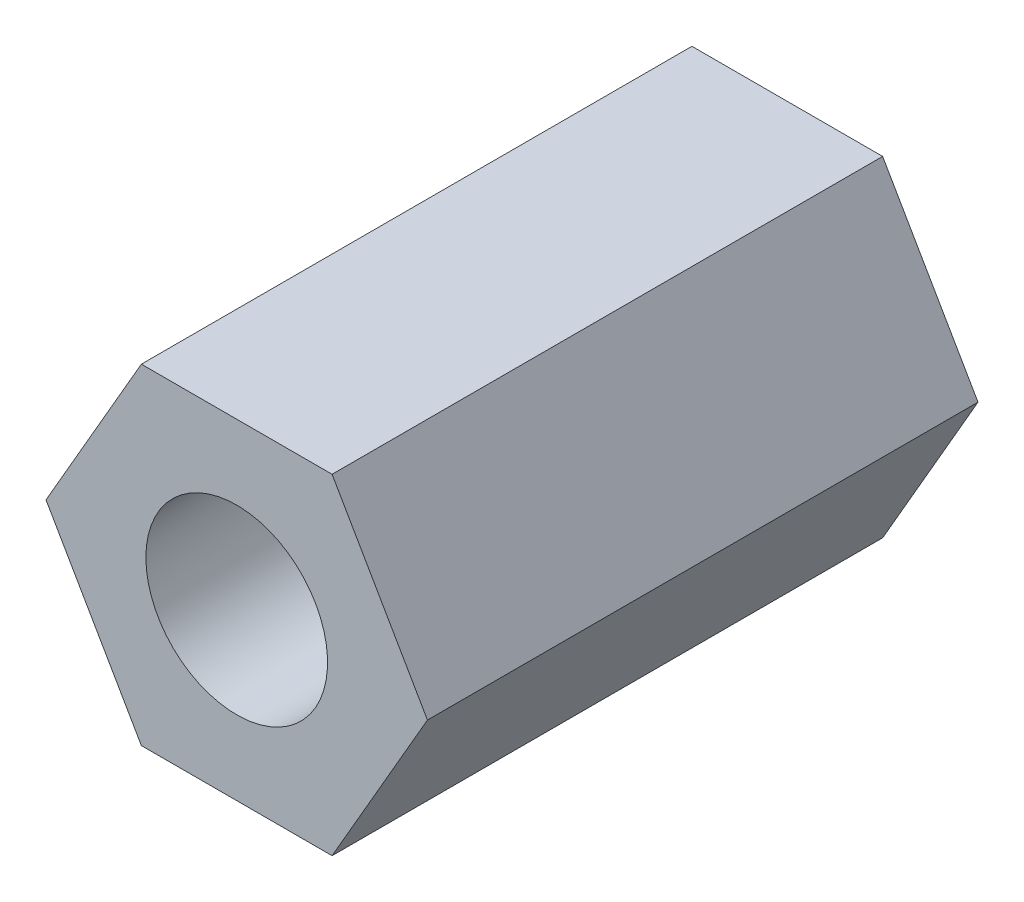
ISO-10303-21;
HEADER;
FILE_DESCRIPTION(('STEP AP214'),'2;1');
FILE_NAME('part.step','',(''),(''),'','','');
FILE_SCHEMA(('AUTOMOTIVE_DESIGN { 1 0 10303 214 1 1 1 1 }'));
ENDSEC;
DATA;
#1=APPLICATION_CONTEXT('core data for automotive mechanical design processes');
#2=APPLICATION_PROTOCOL_DEFINITION('international standard','automotive_design',2000,#1);
#3=PRODUCT_CONTEXT('',#1,'mechanical');
#4=PRODUCT('Part','Part','',(#3));
#5=PRODUCT_RELATED_PRODUCT_CATEGORY('part','',(#4));
#6=PRODUCT_DEFINITION_FORMATION('','',#4);
#7=PRODUCT_DEFINITION_CONTEXT('part definition',#1,'design');
#8=PRODUCT_DEFINITION('design','',#6,#7);
#9=PRODUCT_DEFINITION_SHAPE('','',#8);
#10=(LENGTH_UNIT() NAMED_UNIT(*) SI_UNIT(.MILLI.,.METRE.));
#11=(NAMED_UNIT(*) PLANE_ANGLE_UNIT() SI_UNIT($,.RADIAN.));
#12=(NAMED_UNIT(*) SI_UNIT($,.STERADIAN.) SOLID_ANGLE_UNIT());
#13=UNCERTAINTY_MEASURE_WITH_UNIT(LENGTH_MEASURE(1.E-05),#10,'distance_accuracy_value','');
#14=(GEOMETRIC_REPRESENTATION_CONTEXT(3) GLOBAL_UNCERTAINTY_ASSIGNED_CONTEXT((#13)) GLOBAL_UNIT_ASSIGNED_CONTEXT((#10,
#11,#12)) REPRESENTATION_CONTEXT('',''));
#15=CARTESIAN_POINT('',(0.,0.,0.));
#16=DIRECTION('',(0.,0.,1.));
#17=DIRECTION('',(1.,0.,0.));
#18=AXIS2_PLACEMENT_3D('',#15,#16,#17);
#19=CARTESIAN_POINT('',(1.7320508075689,-2.99999999999996,10.));
#20=DIRECTION('',(-0.866025403784442,0.499999999999995,0.));
#21=DIRECTION('',(-0.499999999999995,-0.866025403784442,0.));
#22=AXIS2_PLACEMENT_3D('',#19,#20,#21);
#23=PLANE('',#22);
#24=DIRECTION('',(0.499999999999995,0.866025403784442,0.));
#25=VECTOR('',#24,1.);
#26=CARTESIAN_POINT('',(1.7320508075689,-2.99999999999996,0.));
#27=LINE('',#26,#25);
#28=CARTESIAN_POINT('',(1.7320508075689,-2.99999999999996,0.));
#29=VERTEX_POINT('',#28);
#30=CARTESIAN_POINT('',(3.46410161513774,0.,0.));
#31=VERTEX_POINT('',#30);
#32=EDGE_CURVE('E140',#29,#31,#27,.T.);
#33=ORIENTED_EDGE('',*,*,#32,.T.);
#34=DIRECTION('',(0.,0.,-1.));
#35=VECTOR('',#34,1.);
#36=CARTESIAN_POINT('',(3.46410161513774,0.,10.));
#37=LINE('',#36,#35);
#38=CARTESIAN_POINT('',(3.46410161513774,0.,10.));
#39=VERTEX_POINT('',#38);
#40=EDGE_CURVE('E11',#39,#31,#37,.T.);
#41=ORIENTED_EDGE('',*,*,#40,.F.);
#42=DIRECTION('',(0.499999999999995,0.866025403784442,0.));
#43=VECTOR('',#42,1.);
#44=CARTESIAN_POINT('',(1.7320508075689,-2.99999999999996,10.));
#45=LINE('',#44,#43);
#46=CARTESIAN_POINT('',(1.7320508075689,-2.99999999999996,10.));
#47=VERTEX_POINT('',#46);
#48=EDGE_CURVE('E157',#47,#39,#45,.T.);
#49=ORIENTED_EDGE('',*,*,#48,.F.);
#50=DIRECTION('',(0.,0.,-1.));
#51=VECTOR('',#50,1.);
#52=CARTESIAN_POINT('',(1.7320508075689,-2.99999999999996,10.));
#53=LINE('',#52,#51);
#54=EDGE_CURVE('E136',#47,#29,#53,.T.);
#55=ORIENTED_EDGE('',*,*,#54,.T.);
#56=EDGE_LOOP('',(#33,#41,#49,#55));
#57=FACE_BOUND('',#56,.T.);
#58=ADVANCED_FACE('F51',(#57),#23,.F.);
#59=CARTESIAN_POINT('',(3.46410161513774,0.,10.));
#60=DIRECTION('',(-0.866025403784438,-0.500000000000001,0.));
#61=DIRECTION('',(0.500000000000001,-0.866025403784438,0.));
#62=AXIS2_PLACEMENT_3D('',#59,#60,#61);
#63=PLANE('',#62);
#64=DIRECTION('',(-0.500000000000001,0.866025403784438,0.));
#65=VECTOR('',#64,1.);
#66=CARTESIAN_POINT('',(3.46410161513774,0.,0.));
#67=LINE('',#66,#65);
#68=CARTESIAN_POINT('',(1.73205080756886,2.99999999999999,0.));
#69=VERTEX_POINT('',#68);
#70=EDGE_CURVE('E144',#31,#69,#67,.T.);
#71=ORIENTED_EDGE('',*,*,#70,.T.);
#72=DIRECTION('',(0.,0.,-1.));
#73=VECTOR('',#72,1.);
#74=CARTESIAN_POINT('',(1.73205080756886,2.99999999999999,10.));
#75=LINE('',#74,#73);
#76=CARTESIAN_POINT('',(1.73205080756886,2.99999999999999,10.));
#77=VERTEX_POINT('',#76);
#78=EDGE_CURVE('E60',#77,#69,#75,.T.);
#79=ORIENTED_EDGE('',*,*,#78,.F.);
#80=DIRECTION('',(-0.500000000000001,0.866025403784438,0.));
#81=VECTOR('',#80,1.);
#82=CARTESIAN_POINT('',(3.46410161513774,0.,10.));
#83=LINE('',#82,#81);
#84=EDGE_CURVE('E105',#39,#77,#83,.T.);
#85=ORIENTED_EDGE('',*,*,#84,.F.);
#86=ORIENTED_EDGE('',*,*,#40,.T.);
#87=EDGE_LOOP('',(#71,#79,#85,#86));
#88=FACE_BOUND('',#87,.T.);
#89=ADVANCED_FACE('F186',(#88),#63,.F.);
#90=CARTESIAN_POINT('',(1.73205080756886,2.99999999999999,10.));
#91=DIRECTION('',(0.,-1.,0.));
#92=DIRECTION('',(1.,0.,0.));
#93=AXIS2_PLACEMENT_3D('',#90,#91,#92);
#94=PLANE('',#93);
#95=DIRECTION('',(-1.,0.,0.));
#96=VECTOR('',#95,1.);
#97=CARTESIAN_POINT('',(1.73205080756886,2.99999999999999,0.));
#98=LINE('',#97,#96);
#99=CARTESIAN_POINT('',(-1.73205080756888,2.99999999999998,0.));
#100=VERTEX_POINT('',#99);
#101=EDGE_CURVE('E148',#69,#100,#98,.T.);
#102=ORIENTED_EDGE('',*,*,#101,.T.);
#103=DIRECTION('',(0.,0.,-1.));
#104=VECTOR('',#103,1.);
#105=CARTESIAN_POINT('',(-1.73205080756888,2.99999999999998,10.));
#106=LINE('',#105,#104);
#107=CARTESIAN_POINT('',(-1.73205080756888,2.99999999999998,10.));
#108=VERTEX_POINT('',#107);
#109=EDGE_CURVE('E129',#108,#100,#106,.T.);
#110=ORIENTED_EDGE('',*,*,#109,.F.);
#111=DIRECTION('',(-1.,0.,0.));
#112=VECTOR('',#111,1.);
#113=CARTESIAN_POINT('',(1.73205080756886,2.99999999999999,10.));
#114=LINE('',#113,#112);
#115=EDGE_CURVE('E118',#77,#108,#114,.T.);
#116=ORIENTED_EDGE('',*,*,#115,.F.);
#117=ORIENTED_EDGE('',*,*,#78,.T.);
#118=EDGE_LOOP('',(#102,#110,#116,#117));
#119=FACE_BOUND('',#118,.T.);
#120=ADVANCED_FACE('F167',(#119),#94,.F.);
#121=CARTESIAN_POINT('',(-1.73205080756888,2.99999999999998,10.));
#122=DIRECTION('',(0.866025403784442,-0.499999999999995,0.));
#123=DIRECTION('',(0.499999999999995,0.866025403784442,0.));
#124=AXIS2_PLACEMENT_3D('',#121,#122,#123);
#125=PLANE('',#124);
#126=DIRECTION('',(-0.499999999999995,-0.866025403784442,0.));
#127=VECTOR('',#126,1.);
#128=CARTESIAN_POINT('',(-1.73205080756888,2.99999999999998,0.));
#129=LINE('',#128,#127);
#130=CARTESIAN_POINT('',(-3.46410161513774,0.,0.));
#131=VERTEX_POINT('',#130);
#132=EDGE_CURVE('E127',#100,#131,#129,.T.);
#133=ORIENTED_EDGE('',*,*,#132,.T.);
#134=DIRECTION('',(0.,0.,-1.));
#135=VECTOR('',#134,1.);
#136=CARTESIAN_POINT('',(-3.46410161513774,0.,10.));
#137=LINE('',#136,#135);
#138=CARTESIAN_POINT('',(-3.46410161513774,0.,10.));
#139=VERTEX_POINT('',#138);
#140=EDGE_CURVE('E124',#139,#131,#137,.T.);
#141=ORIENTED_EDGE('',*,*,#140,.F.);
#142=DIRECTION('',(-0.499999999999995,-0.866025403784442,0.));
#143=VECTOR('',#142,1.);
#144=CARTESIAN_POINT('',(-1.73205080756888,2.99999999999998,10.));
#145=LINE('',#144,#143);
#146=EDGE_CURVE('E112',#108,#139,#145,.T.);
#147=ORIENTED_EDGE('',*,*,#146,.F.);
#148=ORIENTED_EDGE('',*,*,#109,.T.);
#149=EDGE_LOOP('',(#133,#141,#147,#148));
#150=FACE_BOUND('',#149,.T.);
#151=ADVANCED_FACE('F125',(#150),#125,.F.);
#152=CARTESIAN_POINT('',(-3.46410161513774,0.,10.));
#153=DIRECTION('',(0.866025403784434,0.500000000000007,0.));
#154=DIRECTION('',(-0.500000000000007,0.866025403784435,0.));
#155=AXIS2_PLACEMENT_3D('',#152,#153,#154);
#156=PLANE('',#155);
#157=DIRECTION('',(0.500000000000007,-0.866025403784435,0.));
#158=VECTOR('',#157,1.);
#159=CARTESIAN_POINT('',(-3.46410161513774,0.,0.));
#160=LINE('',#159,#158);
#161=CARTESIAN_POINT('',(-1.73205080756884,-3.,0.));
#162=VERTEX_POINT('',#161);
#163=EDGE_CURVE('E91',#131,#162,#160,.T.);
#164=ORIENTED_EDGE('',*,*,#163,.T.);
#165=DIRECTION('',(0.,0.,-1.));
#166=VECTOR('',#165,1.);
#167=CARTESIAN_POINT('',(-1.73205080756884,-3.,10.));
#168=LINE('',#167,#166);
#169=CARTESIAN_POINT('',(-1.73205080756884,-3.,10.));
#170=VERTEX_POINT('',#169);
#171=EDGE_CURVE('E130',#170,#162,#168,.T.);
#172=ORIENTED_EDGE('',*,*,#171,.F.);
#173=DIRECTION('',(0.500000000000007,-0.866025403784435,0.));
#174=VECTOR('',#173,1.);
#175=CARTESIAN_POINT('',(-3.46410161513774,0.,10.));
#176=LINE('',#175,#174);
#177=EDGE_CURVE('E116',#139,#170,#176,.T.);
#178=ORIENTED_EDGE('',*,*,#177,.F.);
#179=ORIENTED_EDGE('',*,*,#140,.T.);
#180=EDGE_LOOP('',(#164,#172,#178,#179));
#181=FACE_BOUND('',#180,.T.);
#182=ADVANCED_FACE('F132',(#181),#156,.F.);
#183=CARTESIAN_POINT('',(-1.73205080756884,-3.,10.));
#184=DIRECTION('',(0.,1.,0.));
#185=DIRECTION('',(-1.,0.,0.));
#186=AXIS2_PLACEMENT_3D('',#183,#184,#185);
#187=PLANE('',#186);
#188=DIRECTION('',(1.,0.,0.));
#189=VECTOR('',#188,1.);
#190=CARTESIAN_POINT('',(-1.73205080756884,-3.,0.));
#191=LINE('',#190,#189);
#192=EDGE_CURVE('E97',#162,#29,#191,.T.);
#193=ORIENTED_EDGE('',*,*,#192,.T.);
#194=ORIENTED_EDGE('',*,*,#54,.F.);
#195=DIRECTION('',(1.,0.,0.));
#196=VECTOR('',#195,1.);
#197=CARTESIAN_POINT('',(-1.73205080756884,-3.,10.));
#198=LINE('',#197,#196);
#199=EDGE_CURVE('E68',#170,#47,#198,.T.);
#200=ORIENTED_EDGE('',*,*,#199,.F.);
#201=ORIENTED_EDGE('',*,*,#171,.T.);
#202=EDGE_LOOP('',(#193,#194,#200,#201));
#203=FACE_BOUND('',#202,.T.);
#204=ADVANCED_FACE('F174',(#203),#187,.F.);
#205=CARTESIAN_POINT('',(0.,0.,10.));
#206=DIRECTION('',(0.,0.,1.));
#207=DIRECTION('',(1.,0.,0.));
#208=AXIS2_PLACEMENT_3D('',#205,#206,#207);
#209=PLANE('',#208);
#210=CARTESIAN_POINT('',(0.,0.,10.));
#211=DIRECTION('',(0.,0.,-1.));
#212=DIRECTION('',(-1.,0.,0.));
#213=AXIS2_PLACEMENT_3D('',#210,#211,#212);
#214=CIRCLE('',#213,1.65);
#215=CARTESIAN_POINT('',(-1.65,0.,10.));
#216=VERTEX_POINT('',#215);
#217=EDGE_CURVE('E145',#216,#216,#214,.T.);
#218=ORIENTED_EDGE('',*,*,#217,.T.);
#219=EDGE_LOOP('',(#218));
#220=FACE_BOUND('',#219,.T.);
#221=ORIENTED_EDGE('',*,*,#48,.T.);
#222=ORIENTED_EDGE('',*,*,#84,.T.);
#223=ORIENTED_EDGE('',*,*,#115,.T.);
#224=ORIENTED_EDGE('',*,*,#146,.T.);
#225=ORIENTED_EDGE('',*,*,#177,.T.);
#226=ORIENTED_EDGE('',*,*,#199,.T.);
#227=EDGE_LOOP('',(#221,#222,#223,#224,#225,#226));
#228=FACE_BOUND('',#227,.T.);
#229=ADVANCED_FACE('F114',(#220,#228),#209,.T.);
#230=CARTESIAN_POINT('',(0.,0.,0.));
#231=DIRECTION('',(0.,0.,1.));
#232=DIRECTION('',(1.,0.,0.));
#233=AXIS2_PLACEMENT_3D('',#230,#231,#232);
#234=PLANE('',#233);
#235=CARTESIAN_POINT('',(0.,0.,0.));
#236=DIRECTION('',(0.,0.,-1.));
#237=DIRECTION('',(-1.,0.,0.));
#238=AXIS2_PLACEMENT_3D('',#235,#236,#237);
#239=CIRCLE('',#238,2.025);
#240=CARTESIAN_POINT('',(-2.025,0.,0.));
#241=VERTEX_POINT('',#240);
#242=EDGE_CURVE('E255',#241,#241,#239,.T.);
#243=ORIENTED_EDGE('',*,*,#242,.F.);
#244=EDGE_LOOP('',(#243));
#245=FACE_BOUND('',#244,.T.);
#246=ORIENTED_EDGE('',*,*,#32,.F.);
#247=ORIENTED_EDGE('',*,*,#192,.F.);
#248=ORIENTED_EDGE('',*,*,#163,.F.);
#249=ORIENTED_EDGE('',*,*,#132,.F.);
#250=ORIENTED_EDGE('',*,*,#101,.F.);
#251=ORIENTED_EDGE('',*,*,#70,.F.);
#252=EDGE_LOOP('',(#246,#247,#248,#249,#250,#251));
#253=FACE_BOUND('',#252,.T.);
#254=ADVANCED_FACE('F170',(#245,#253),#234,.F.);
#255=CARTESIAN_POINT('',(0.,0.,0.));
#256=DIRECTION('',(0.,0.,-1.));
#257=DIRECTION('',(-1.,0.,0.));
#258=AXIS2_PLACEMENT_3D('',#255,#256,#257);
#259=CYLINDRICAL_SURFACE('',#258,1.65);
#260=ORIENTED_EDGE('',*,*,#217,.F.);
#261=EDGE_LOOP('',(#260));
#262=FACE_BOUND('',#261,.T.);
#263=CARTESIAN_POINT('',(0.,0.,0.375000000000002));
#264=DIRECTION('',(0.,0.,-1.));
#265=DIRECTION('',(-1.,0.,0.));
#266=AXIS2_PLACEMENT_3D('',#263,#264,#265);
#267=CIRCLE('',#266,1.65);
#268=CARTESIAN_POINT('',(-1.65,0.,0.375000000000002));
#269=VERTEX_POINT('',#268);
#270=EDGE_CURVE('E252',#269,#269,#267,.T.);
#271=ORIENTED_EDGE('',*,*,#270,.T.);
#272=EDGE_LOOP('',(#271));
#273=FACE_BOUND('',#272,.T.);
#274=ADVANCED_FACE('F225',(#262,#273),#259,.F.);
#275=CARTESIAN_POINT('',(0.,0.,0.));
#276=DIRECTION('',(0.,0.,-1.));
#277=DIRECTION('',(-1.,0.,0.));
#278=AXIS2_PLACEMENT_3D('',#275,#276,#277);
#279=CONICAL_SURFACE('',#278,2.025,0.785398163397447);
#280=ORIENTED_EDGE('',*,*,#270,.F.);
#281=EDGE_LOOP('',(#280));
#282=FACE_BOUND('',#281,.T.);
#283=ORIENTED_EDGE('',*,*,#242,.T.);
#284=EDGE_LOOP('',(#283));
#285=FACE_BOUND('',#284,.T.);
#286=ADVANCED_FACE('F235',(#282,#285),#279,.F.);
#287=CLOSED_SHELL('',(#58,#89,#120,#151,#182,#204,#229,#254,#274,#286));
#288=MANIFOLD_SOLID_BREP('B2',#287);
#289=ADVANCED_BREP_SHAPE_REPRESENTATION('',(#18,#288),#14);
#290=SHAPE_DEFINITION_REPRESENTATION(#9,#289);
ENDSEC;
END-ISO-10303-21;
